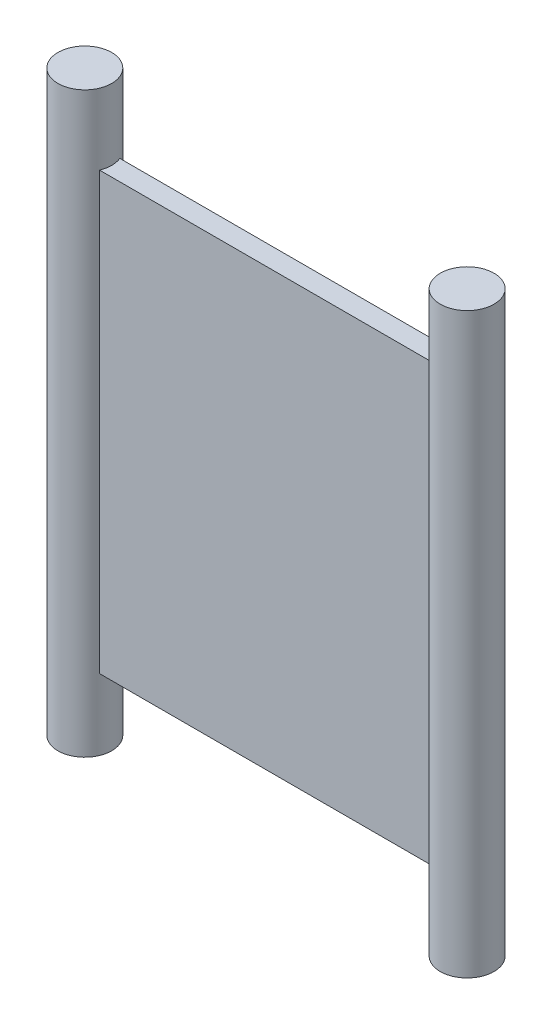
ISO-10303-21;
HEADER;
FILE_DESCRIPTION(('STEP AP214'),'2;1');
FILE_NAME('part.step','',(''),(''),'','','');
FILE_SCHEMA(('AUTOMOTIVE_DESIGN { 1 0 10303 214 1 1 1 1 }'));
ENDSEC;
DATA;
#1=APPLICATION_CONTEXT('core data for automotive mechanical design processes');
#2=APPLICATION_PROTOCOL_DEFINITION('international standard','automotive_design',2000,#1);
#3=PRODUCT_CONTEXT('',#1,'mechanical');
#4=PRODUCT('Part','Part','',(#3));
#5=PRODUCT_RELATED_PRODUCT_CATEGORY('part','',(#4));
#6=PRODUCT_DEFINITION_FORMATION('','',#4);
#7=PRODUCT_DEFINITION_CONTEXT('part definition',#1,'design');
#8=PRODUCT_DEFINITION('design','',#6,#7);
#9=PRODUCT_DEFINITION_SHAPE('','',#8);
#10=(LENGTH_UNIT() NAMED_UNIT(*) SI_UNIT(.MILLI.,.METRE.));
#11=(NAMED_UNIT(*) PLANE_ANGLE_UNIT() SI_UNIT($,.RADIAN.));
#12=(NAMED_UNIT(*) SI_UNIT($,.STERADIAN.) SOLID_ANGLE_UNIT());
#13=UNCERTAINTY_MEASURE_WITH_UNIT(LENGTH_MEASURE(1.E-05),#10,'distance_accuracy_value','');
#14=(GEOMETRIC_REPRESENTATION_CONTEXT(3) GLOBAL_UNCERTAINTY_ASSIGNED_CONTEXT((#13)) GLOBAL_UNIT_ASSIGNED_CONTEXT((#10,
#11,#12)) REPRESENTATION_CONTEXT('',''));
#15=CARTESIAN_POINT('',(0.,0.,0.));
#16=DIRECTION('',(0.,0.,1.));
#17=DIRECTION('',(1.,0.,0.));
#18=AXIS2_PLACEMENT_3D('',#15,#16,#17);
#19=CARTESIAN_POINT('',(9.426,21.5,0.499999999999999));
#20=DIRECTION('',(0.,0.,-1.));
#21=DIRECTION('',(-1.,0.,0.));
#22=AXIS2_PLACEMENT_3D('',#19,#20,#21);
#23=PLANE('',#22);
#24=DIRECTION('',(0.,-1.,0.));
#25=VECTOR('',#24,1.);
#26=CARTESIAN_POINT('',(8.1989608808192,25.,0.499999999999999));
#27=LINE('',#26,#25);
#28=CARTESIAN_POINT('',(8.1989608808192,21.5,0.499999999999999));
#29=VERTEX_POINT('',#28);
#30=CARTESIAN_POINT('',(8.1989608808192,0.,0.499999999999999));
#31=VERTEX_POINT('',#30);
#32=EDGE_CURVE('E53',#29,#31,#27,.T.);
#33=ORIENTED_EDGE('',*,*,#32,.F.);
#34=DIRECTION('',(1.,0.,0.));
#35=VECTOR('',#34,1.);
#36=CARTESIAN_POINT('',(9.426,21.5,0.499999999999999));
#37=LINE('',#36,#35);
#38=CARTESIAN_POINT('',(-8.1989608808192,21.5,0.500000000000001));
#39=VERTEX_POINT('',#38);
#40=EDGE_CURVE('E90',#39,#29,#37,.T.);
#41=ORIENTED_EDGE('',*,*,#40,.F.);
#42=DIRECTION('',(0.,-1.,0.));
#43=VECTOR('',#42,1.);
#44=CARTESIAN_POINT('',(-8.1989608808192,25.,0.500000000000001));
#45=LINE('',#44,#43);
#46=CARTESIAN_POINT('',(-8.1989608808192,0.,0.500000000000001));
#47=VERTEX_POINT('',#46);
#48=EDGE_CURVE('E103',#47,#39,#45,.F.);
#49=ORIENTED_EDGE('',*,*,#48,.F.);
#50=DIRECTION('',(1.,0.,0.));
#51=VECTOR('',#50,1.);
#52=CARTESIAN_POINT('',(9.426,0.,0.499999999999999));
#53=LINE('',#52,#51);
#54=EDGE_CURVE('E91',#47,#31,#53,.T.);
#55=ORIENTED_EDGE('',*,*,#54,.T.);
#56=EDGE_LOOP('',(#33,#41,#49,#55));
#57=FACE_BOUND('',#56,.T.);
#58=ADVANCED_FACE('F39',(#57),#23,.F.);
#59=CARTESIAN_POINT('',(9.426,21.5,-0.500000000000001));
#60=DIRECTION('',(0.,0.,1.));
#61=DIRECTION('',(1.,0.,0.));
#62=AXIS2_PLACEMENT_3D('',#59,#60,#61);
#63=PLANE('',#62);
#64=DIRECTION('',(0.,-1.,0.));
#65=VECTOR('',#64,1.);
#66=CARTESIAN_POINT('',(8.1989608808192,25.,-0.500000000000001));
#67=LINE('',#66,#65);
#68=CARTESIAN_POINT('',(8.1989608808192,0.,-0.500000000000001));
#69=VERTEX_POINT('',#68);
#70=CARTESIAN_POINT('',(8.1989608808192,21.5,-0.500000000000001));
#71=VERTEX_POINT('',#70);
#72=EDGE_CURVE('E78',#69,#71,#67,.F.);
#73=ORIENTED_EDGE('',*,*,#72,.F.);
#74=DIRECTION('',(-1.,0.,0.));
#75=VECTOR('',#74,1.);
#76=CARTESIAN_POINT('',(9.426,0.,-0.500000000000001));
#77=LINE('',#76,#75);
#78=CARTESIAN_POINT('',(-8.1989608808192,0.,-0.499999999999999));
#79=VERTEX_POINT('',#78);
#80=EDGE_CURVE('E60',#69,#79,#77,.T.);
#81=ORIENTED_EDGE('',*,*,#80,.T.);
#82=DIRECTION('',(0.,-1.,0.));
#83=VECTOR('',#82,1.);
#84=CARTESIAN_POINT('',(-8.1989608808192,25.,-0.499999999999999));
#85=LINE('',#84,#83);
#86=CARTESIAN_POINT('',(-8.1989608808192,21.5,-0.499999999999999));
#87=VERTEX_POINT('',#86);
#88=EDGE_CURVE('E105',#87,#79,#85,.T.);
#89=ORIENTED_EDGE('',*,*,#88,.F.);
#90=DIRECTION('',(-1.,0.,0.));
#91=VECTOR('',#90,1.);
#92=CARTESIAN_POINT('',(9.426,21.5,-0.500000000000001));
#93=LINE('',#92,#91);
#94=EDGE_CURVE('E85',#71,#87,#93,.T.);
#95=ORIENTED_EDGE('',*,*,#94,.F.);
#96=EDGE_LOOP('',(#73,#81,#89,#95));
#97=FACE_BOUND('',#96,.T.);
#98=ADVANCED_FACE('F84',(#97),#63,.F.);
#99=CARTESIAN_POINT('',(-9.426,25.,0.));
#100=DIRECTION('',(0.,-1.,0.));
#101=DIRECTION('',(0.,0.,-1.));
#102=AXIS2_PLACEMENT_3D('',#99,#100,#101);
#103=CYLINDRICAL_SURFACE('',#102,1.325);
#104=CARTESIAN_POINT('',(-9.426,25.,0.));
#105=DIRECTION('',(0.,1.,0.));
#106=DIRECTION('',(0.,0.,1.));
#107=AXIS2_PLACEMENT_3D('',#104,#105,#106);
#108=CIRCLE('',#107,1.325);
#109=CARTESIAN_POINT('',(-9.426,25.,1.325));
#110=VERTEX_POINT('',#109);
#111=EDGE_CURVE('E107',#110,#110,#108,.T.);
#112=ORIENTED_EDGE('',*,*,#111,.F.);
#113=EDGE_LOOP('',(#112));
#114=FACE_BOUND('',#113,.T.);
#115=CARTESIAN_POINT('',(-9.426,-3.5,0.));
#116=DIRECTION('',(0.,1.,0.));
#117=DIRECTION('',(0.,0.,1.));
#118=AXIS2_PLACEMENT_3D('',#115,#116,#117);
#119=CIRCLE('',#118,1.325);
#120=CARTESIAN_POINT('',(-9.426,-3.5,1.325));
#121=VERTEX_POINT('',#120);
#122=EDGE_CURVE('E108',#121,#121,#119,.T.);
#123=ORIENTED_EDGE('',*,*,#122,.T.);
#124=EDGE_LOOP('',(#123));
#125=FACE_BOUND('',#124,.T.);
#126=ORIENTED_EDGE('',*,*,#48,.T.);
#127=CARTESIAN_POINT('',(-9.426,21.5,0.));
#128=DIRECTION('',(0.,-1.,0.));
#129=DIRECTION('',(0.,0.,-1.));
#130=AXIS2_PLACEMENT_3D('',#127,#128,#129);
#131=CIRCLE('',#130,1.325);
#132=EDGE_CURVE('E95',#39,#87,#131,.F.);
#133=ORIENTED_EDGE('',*,*,#132,.T.);
#134=ORIENTED_EDGE('',*,*,#88,.T.);
#135=CARTESIAN_POINT('',(-9.426,0.,0.));
#136=DIRECTION('',(0.,-1.,0.));
#137=DIRECTION('',(0.,0.,-1.));
#138=AXIS2_PLACEMENT_3D('',#135,#136,#137);
#139=CIRCLE('',#138,1.325);
#140=EDGE_CURVE('E46',#47,#79,#139,.F.);
#141=ORIENTED_EDGE('',*,*,#140,.F.);
#142=EDGE_LOOP('',(#126,#133,#134,#141));
#143=FACE_BOUND('',#142,.T.);
#144=ADVANCED_FACE('F138',(#114,#125,#143),#103,.T.);
#145=CARTESIAN_POINT('',(-9.426,25.,0.));
#146=DIRECTION('',(0.,1.,0.));
#147=DIRECTION('',(0.,0.,1.));
#148=AXIS2_PLACEMENT_3D('',#145,#146,#147);
#149=PLANE('',#148);
#150=ORIENTED_EDGE('',*,*,#111,.T.);
#151=EDGE_LOOP('',(#150));
#152=FACE_BOUND('',#151,.T.);
#153=ADVANCED_FACE('F144',(#152),#149,.T.);
#154=CARTESIAN_POINT('',(-9.426,-3.5,0.));
#155=DIRECTION('',(0.,1.,0.));
#156=DIRECTION('',(0.,0.,1.));
#157=AXIS2_PLACEMENT_3D('',#154,#155,#156);
#158=PLANE('',#157);
#159=ORIENTED_EDGE('',*,*,#122,.F.);
#160=EDGE_LOOP('',(#159));
#161=FACE_BOUND('',#160,.T.);
#162=ADVANCED_FACE('F150',(#161),#158,.F.);
#163=CARTESIAN_POINT('',(0.,21.5,0.));
#164=DIRECTION('',(0.,-1.,0.));
#165=DIRECTION('',(0.,0.,-1.));
#166=AXIS2_PLACEMENT_3D('',#163,#164,#165);
#167=PLANE('',#166);
#168=CARTESIAN_POINT('',(9.426,21.5,0.));
#169=DIRECTION('',(0.,-1.,0.));
#170=DIRECTION('',(0.,0.,-1.));
#171=AXIS2_PLACEMENT_3D('',#168,#169,#170);
#172=CIRCLE('',#171,1.325);
#173=EDGE_CURVE('E111',#71,#29,#172,.F.);
#174=ORIENTED_EDGE('',*,*,#173,.F.);
#175=ORIENTED_EDGE('',*,*,#94,.T.);
#176=ORIENTED_EDGE('',*,*,#132,.F.);
#177=ORIENTED_EDGE('',*,*,#40,.T.);
#178=EDGE_LOOP('',(#174,#175,#176,#177));
#179=FACE_BOUND('',#178,.T.);
#180=ADVANCED_FACE('F141',(#179),#167,.F.);
#181=CARTESIAN_POINT('',(0.,0.,0.));
#182=DIRECTION('',(0.,-1.,0.));
#183=DIRECTION('',(0.,0.,-1.));
#184=AXIS2_PLACEMENT_3D('',#181,#182,#183);
#185=PLANE('',#184);
#186=ORIENTED_EDGE('',*,*,#80,.F.);
#187=CARTESIAN_POINT('',(9.426,0.,0.));
#188=DIRECTION('',(0.,-1.,0.));
#189=DIRECTION('',(0.,0.,-1.));
#190=AXIS2_PLACEMENT_3D('',#187,#188,#189);
#191=CIRCLE('',#190,1.325);
#192=EDGE_CURVE('E11',#69,#31,#191,.F.);
#193=ORIENTED_EDGE('',*,*,#192,.T.);
#194=ORIENTED_EDGE('',*,*,#54,.F.);
#195=ORIENTED_EDGE('',*,*,#140,.T.);
#196=EDGE_LOOP('',(#186,#193,#194,#195));
#197=FACE_BOUND('',#196,.T.);
#198=ADVANCED_FACE('F89',(#197),#185,.T.);
#199=CARTESIAN_POINT('',(9.426,25.,0.));
#200=DIRECTION('',(0.,-1.,0.));
#201=DIRECTION('',(0.,0.,-1.));
#202=AXIS2_PLACEMENT_3D('',#199,#200,#201);
#203=CYLINDRICAL_SURFACE('',#202,1.325);
#204=CARTESIAN_POINT('',(9.426,25.,0.));
#205=DIRECTION('',(0.,1.,0.));
#206=DIRECTION('',(0.,0.,1.));
#207=AXIS2_PLACEMENT_3D('',#204,#205,#206);
#208=CIRCLE('',#207,1.325);
#209=CARTESIAN_POINT('',(9.426,25.,1.325));
#210=VERTEX_POINT('',#209);
#211=EDGE_CURVE('E116',#210,#210,#208,.T.);
#212=ORIENTED_EDGE('',*,*,#211,.F.);
#213=EDGE_LOOP('',(#212));
#214=FACE_BOUND('',#213,.T.);
#215=CARTESIAN_POINT('',(9.426,-3.5,0.));
#216=DIRECTION('',(0.,1.,0.));
#217=DIRECTION('',(0.,0.,1.));
#218=AXIS2_PLACEMENT_3D('',#215,#216,#217);
#219=CIRCLE('',#218,1.325);
#220=CARTESIAN_POINT('',(9.426,-3.5,1.325));
#221=VERTEX_POINT('',#220);
#222=EDGE_CURVE('E86',#221,#221,#219,.T.);
#223=ORIENTED_EDGE('',*,*,#222,.T.);
#224=EDGE_LOOP('',(#223));
#225=FACE_BOUND('',#224,.T.);
#226=ORIENTED_EDGE('',*,*,#72,.T.);
#227=ORIENTED_EDGE('',*,*,#173,.T.);
#228=ORIENTED_EDGE('',*,*,#32,.T.);
#229=ORIENTED_EDGE('',*,*,#192,.F.);
#230=EDGE_LOOP('',(#226,#227,#228,#229));
#231=FACE_BOUND('',#230,.T.);
#232=ADVANCED_FACE('F77',(#214,#225,#231),#203,.T.);
#233=CARTESIAN_POINT('',(9.426,25.,0.));
#234=DIRECTION('',(0.,1.,0.));
#235=DIRECTION('',(0.,0.,1.));
#236=AXIS2_PLACEMENT_3D('',#233,#234,#235);
#237=PLANE('',#236);
#238=ORIENTED_EDGE('',*,*,#211,.T.);
#239=EDGE_LOOP('',(#238));
#240=FACE_BOUND('',#239,.T.);
#241=ADVANCED_FACE('F125',(#240),#237,.T.);
#242=CARTESIAN_POINT('',(9.426,-3.5,0.));
#243=DIRECTION('',(0.,1.,0.));
#244=DIRECTION('',(0.,0.,1.));
#245=AXIS2_PLACEMENT_3D('',#242,#243,#244);
#246=PLANE('',#245);
#247=ORIENTED_EDGE('',*,*,#222,.F.);
#248=EDGE_LOOP('',(#247));
#249=FACE_BOUND('',#248,.T.);
#250=ADVANCED_FACE('F123',(#249),#246,.F.);
#251=CLOSED_SHELL('',(#58,#98,#144,#153,#162,#180,#198,#232,#241,#250));
#252=MANIFOLD_SOLID_BREP('B2',#251);
#253=ADVANCED_BREP_SHAPE_REPRESENTATION('',(#18,#252),#14);
#254=SHAPE_DEFINITION_REPRESENTATION(#9,#253);
ENDSEC;
END-ISO-10303-21;
